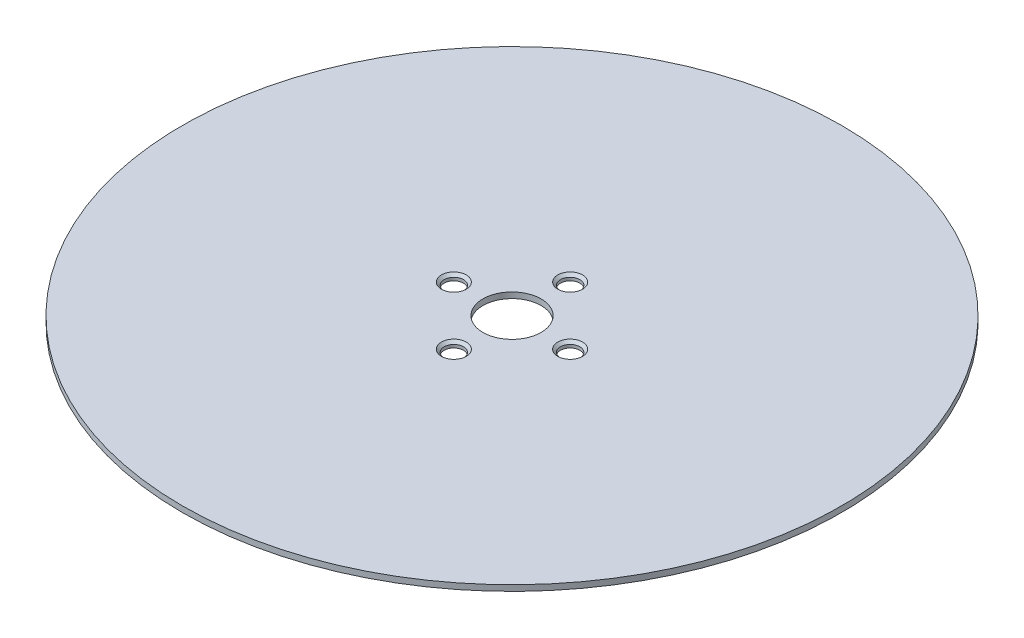
ISO-10303-21;
HEADER;
FILE_DESCRIPTION(('STEP AP214'),'2;1');
FILE_NAME('part.step','',(''),(''),'','','');
FILE_SCHEMA(('AUTOMOTIVE_DESIGN { 1 0 10303 214 1 1 1 1 }'));
ENDSEC;
DATA;
#1=APPLICATION_CONTEXT('core data for automotive mechanical design processes');
#2=APPLICATION_PROTOCOL_DEFINITION('international standard','automotive_design',2000,#1);
#3=PRODUCT_CONTEXT('',#1,'mechanical');
#4=PRODUCT('Part','Part','',(#3));
#5=PRODUCT_RELATED_PRODUCT_CATEGORY('part','',(#4));
#6=PRODUCT_DEFINITION_FORMATION('','',#4);
#7=PRODUCT_DEFINITION_CONTEXT('part definition',#1,'design');
#8=PRODUCT_DEFINITION('design','',#6,#7);
#9=PRODUCT_DEFINITION_SHAPE('','',#8);
#10=(LENGTH_UNIT() NAMED_UNIT(*) SI_UNIT(.MILLI.,.METRE.));
#11=(NAMED_UNIT(*) PLANE_ANGLE_UNIT() SI_UNIT($,.RADIAN.));
#12=(NAMED_UNIT(*) SI_UNIT($,.STERADIAN.) SOLID_ANGLE_UNIT());
#13=UNCERTAINTY_MEASURE_WITH_UNIT(LENGTH_MEASURE(1.E-05),#10,'distance_accuracy_value','');
#14=(GEOMETRIC_REPRESENTATION_CONTEXT(3) GLOBAL_UNCERTAINTY_ASSIGNED_CONTEXT((#13)) GLOBAL_UNIT_ASSIGNED_CONTEXT((#10,
#11,#12)) REPRESENTATION_CONTEXT('',''));
#15=CARTESIAN_POINT('',(0.,0.,0.));
#16=DIRECTION('',(0.,0.,1.));
#17=DIRECTION('',(1.,0.,0.));
#18=AXIS2_PLACEMENT_3D('',#15,#16,#17);
#19=CARTESIAN_POINT('',(0.,1.5,0.));
#20=DIRECTION('',(0.,-1.,0.));
#21=DIRECTION('',(0.,0.,-1.));
#22=AXIS2_PLACEMENT_3D('',#19,#20,#21);
#23=CYLINDRICAL_SURFACE('',#22,15.);
#24=CARTESIAN_POINT('',(0.,1.5,0.));
#25=DIRECTION('',(0.,1.,0.));
#26=DIRECTION('',(0.,0.,1.));
#27=AXIS2_PLACEMENT_3D('',#24,#25,#26);
#28=CIRCLE('',#27,15.);
#29=CARTESIAN_POINT('',(0.,1.5,15.));
#30=VERTEX_POINT('',#29);
#31=EDGE_CURVE('E42',#30,#30,#28,.T.);
#32=ORIENTED_EDGE('',*,*,#31,.T.);
#33=EDGE_LOOP('',(#32));
#34=FACE_BOUND('',#33,.T.);
#35=CARTESIAN_POINT('',(0.,-1.5,0.));
#36=DIRECTION('',(0.,1.,0.));
#37=DIRECTION('',(0.,0.,1.));
#38=AXIS2_PLACEMENT_3D('',#35,#36,#37);
#39=CIRCLE('',#38,15.);
#40=CARTESIAN_POINT('',(0.,-1.5,15.));
#41=VERTEX_POINT('',#40);
#42=EDGE_CURVE('E62',#41,#41,#39,.T.);
#43=ORIENTED_EDGE('',*,*,#42,.F.);
#44=EDGE_LOOP('',(#43));
#45=FACE_BOUND('',#44,.T.);
#46=ADVANCED_FACE('F34',(#34,#45),#23,.F.);
#47=CARTESIAN_POINT('',(1.01070499767852E-13,1.5,-30.));
#48=DIRECTION('',(0.,-1.,0.));
#49=DIRECTION('',(0.,0.,-1.));
#50=AXIS2_PLACEMENT_3D('',#47,#48,#49);
#51=CYLINDRICAL_SURFACE('',#50,5.);
#52=CARTESIAN_POINT('',(1.01070499767852E-13,0.100000000000001,-30.));
#53=DIRECTION('',(0.,1.,0.));
#54=DIRECTION('',(0.,0.,1.));
#55=AXIS2_PLACEMENT_3D('',#52,#53,#54);
#56=CIRCLE('',#55,5.);
#57=CARTESIAN_POINT('',(1.01070499767852E-13,0.100000000000001,-25.));
#58=VERTEX_POINT('',#57);
#59=EDGE_CURVE('E129',#58,#58,#56,.F.);
#60=ORIENTED_EDGE('',*,*,#59,.F.);
#61=EDGE_LOOP('',(#60));
#62=FACE_BOUND('',#61,.T.);
#63=CARTESIAN_POINT('',(1.01070499767852E-13,-1.5,-30.));
#64=DIRECTION('',(0.,1.,0.));
#65=DIRECTION('',(0.,0.,1.));
#66=AXIS2_PLACEMENT_3D('',#63,#64,#65);
#67=CIRCLE('',#66,5.);
#68=CARTESIAN_POINT('',(1.01070499767852E-13,-1.5,-25.));
#69=VERTEX_POINT('',#68);
#70=EDGE_CURVE('E60',#69,#69,#67,.T.);
#71=ORIENTED_EDGE('',*,*,#70,.F.);
#72=EDGE_LOOP('',(#71));
#73=FACE_BOUND('',#72,.T.);
#74=ADVANCED_FACE('F89',(#62,#73),#51,.F.);
#75=CARTESIAN_POINT('',(30.,1.5,2.05814939933146E-13));
#76=DIRECTION('',(0.,-1.,0.));
#77=DIRECTION('',(0.,0.,-1.));
#78=AXIS2_PLACEMENT_3D('',#75,#76,#77);
#79=CYLINDRICAL_SURFACE('',#78,5.);
#80=CARTESIAN_POINT('',(30.,0.0999999999999996,2.05814939933146E-13));
#81=DIRECTION('',(0.,1.,0.));
#82=DIRECTION('',(0.,0.,1.));
#83=AXIS2_PLACEMENT_3D('',#80,#81,#82);
#84=CIRCLE('',#83,5.);
#85=CARTESIAN_POINT('',(30.,0.0999999999999996,5.00000000000021));
#86=VERTEX_POINT('',#85);
#87=EDGE_CURVE('E121',#86,#86,#84,.F.);
#88=ORIENTED_EDGE('',*,*,#87,.F.);
#89=EDGE_LOOP('',(#88));
#90=FACE_BOUND('',#89,.T.);
#91=CARTESIAN_POINT('',(30.,-1.5,2.05814939933146E-13));
#92=DIRECTION('',(0.,1.,0.));
#93=DIRECTION('',(0.,0.,1.));
#94=AXIS2_PLACEMENT_3D('',#91,#92,#93);
#95=CIRCLE('',#94,5.);
#96=CARTESIAN_POINT('',(30.,-1.5,5.00000000000021));
#97=VERTEX_POINT('',#96);
#98=EDGE_CURVE('E57',#97,#97,#95,.T.);
#99=ORIENTED_EDGE('',*,*,#98,.F.);
#100=EDGE_LOOP('',(#99));
#101=FACE_BOUND('',#100,.T.);
#102=ADVANCED_FACE('F95',(#90,#101),#79,.F.);
#103=CARTESIAN_POINT('',(-3.1055938009844E-13,1.5,30.));
#104=DIRECTION('',(0.,-1.,0.));
#105=DIRECTION('',(0.,0.,-1.));
#106=AXIS2_PLACEMENT_3D('',#103,#104,#105);
#107=CYLINDRICAL_SURFACE('',#106,5.);
#108=CARTESIAN_POINT('',(-3.1055938009844E-13,0.100000000000001,30.));
#109=DIRECTION('',(0.,1.,0.));
#110=DIRECTION('',(0.,0.,1.));
#111=AXIS2_PLACEMENT_3D('',#108,#109,#110);
#112=CIRCLE('',#111,5.);
#113=CARTESIAN_POINT('',(-3.1055938009844E-13,0.100000000000001,35.));
#114=VERTEX_POINT('',#113);
#115=EDGE_CURVE('E54',#114,#114,#112,.F.);
#116=ORIENTED_EDGE('',*,*,#115,.F.);
#117=EDGE_LOOP('',(#116));
#118=FACE_BOUND('',#117,.T.);
#119=CARTESIAN_POINT('',(-3.1055938009844E-13,-1.5,30.));
#120=DIRECTION('',(0.,1.,0.));
#121=DIRECTION('',(0.,0.,1.));
#122=AXIS2_PLACEMENT_3D('',#119,#120,#121);
#123=CIRCLE('',#122,5.);
#124=CARTESIAN_POINT('',(-3.1055938009844E-13,-1.5,35.));
#125=VERTEX_POINT('',#124);
#126=EDGE_CURVE('E53',#125,#125,#123,.T.);
#127=ORIENTED_EDGE('',*,*,#126,.F.);
#128=EDGE_LOOP('',(#127));
#129=FACE_BOUND('',#128,.T.);
#130=ADVANCED_FACE('F101',(#118,#129),#107,.F.);
#131=CARTESIAN_POINT('',(-30.,1.5,0.));
#132=DIRECTION('',(0.,-1.,0.));
#133=DIRECTION('',(0.,0.,-1.));
#134=AXIS2_PLACEMENT_3D('',#131,#132,#133);
#135=CYLINDRICAL_SURFACE('',#134,5.);
#136=CARTESIAN_POINT('',(-30.,0.100000000000002,0.));
#137=DIRECTION('',(0.,1.,0.));
#138=DIRECTION('',(0.,0.,1.));
#139=AXIS2_PLACEMENT_3D('',#136,#137,#138);
#140=CIRCLE('',#139,5.);
#141=CARTESIAN_POINT('',(-30.,0.100000000000002,5.));
#142=VERTEX_POINT('',#141);
#143=EDGE_CURVE('E135',#142,#142,#140,.F.);
#144=ORIENTED_EDGE('',*,*,#143,.F.);
#145=EDGE_LOOP('',(#144));
#146=FACE_BOUND('',#145,.T.);
#147=CARTESIAN_POINT('',(-30.,-1.5,0.));
#148=DIRECTION('',(0.,1.,0.));
#149=DIRECTION('',(0.,0.,1.));
#150=AXIS2_PLACEMENT_3D('',#147,#148,#149);
#151=CIRCLE('',#150,5.);
#152=CARTESIAN_POINT('',(-30.,-1.5,5.));
#153=VERTEX_POINT('',#152);
#154=EDGE_CURVE('E50',#153,#153,#151,.T.);
#155=ORIENTED_EDGE('',*,*,#154,.F.);
#156=EDGE_LOOP('',(#155));
#157=FACE_BOUND('',#156,.T.);
#158=ADVANCED_FACE('F36',(#146,#157),#135,.F.);
#159=CARTESIAN_POINT('',(0.,1.5,0.));
#160=DIRECTION('',(0.,-1.,0.));
#161=DIRECTION('',(0.,0.,-1.));
#162=AXIS2_PLACEMENT_3D('',#159,#160,#161);
#163=CYLINDRICAL_SURFACE('',#162,170.);
#164=CARTESIAN_POINT('',(0.,1.5,0.));
#165=DIRECTION('',(0.,1.,0.));
#166=DIRECTION('',(0.,0.,1.));
#167=AXIS2_PLACEMENT_3D('',#164,#165,#166);
#168=CIRCLE('',#167,170.);
#169=CARTESIAN_POINT('',(0.,1.5,170.));
#170=VERTEX_POINT('',#169);
#171=EDGE_CURVE('E10',#170,#170,#168,.T.);
#172=ORIENTED_EDGE('',*,*,#171,.F.);
#173=EDGE_LOOP('',(#172));
#174=FACE_BOUND('',#173,.T.);
#175=CARTESIAN_POINT('',(0.,-1.5,0.));
#176=DIRECTION('',(0.,1.,0.));
#177=DIRECTION('',(0.,0.,1.));
#178=AXIS2_PLACEMENT_3D('',#175,#176,#177);
#179=CIRCLE('',#178,170.);
#180=CARTESIAN_POINT('',(0.,-1.5,170.));
#181=VERTEX_POINT('',#180);
#182=EDGE_CURVE('E38',#181,#181,#179,.T.);
#183=ORIENTED_EDGE('',*,*,#182,.T.);
#184=EDGE_LOOP('',(#183));
#185=FACE_BOUND('',#184,.T.);
#186=ADVANCED_FACE('F69',(#174,#185),#163,.T.);
#187=CARTESIAN_POINT('',(0.,1.5,0.));
#188=DIRECTION('',(0.,1.,0.));
#189=DIRECTION('',(0.,0.,1.));
#190=AXIS2_PLACEMENT_3D('',#187,#188,#189);
#191=PLANE('',#190);
#192=CARTESIAN_POINT('',(-30.,1.5,0.));
#193=DIRECTION('',(0.,1.,0.));
#194=DIRECTION('',(0.,0.,1.));
#195=AXIS2_PLACEMENT_3D('',#192,#193,#194);
#196=CIRCLE('',#195,6.4);
#197=CARTESIAN_POINT('',(-30.,1.5,6.4));
#198=VERTEX_POINT('',#197);
#199=EDGE_CURVE('E138',#198,#198,#196,.T.);
#200=ORIENTED_EDGE('',*,*,#199,.F.);
#201=EDGE_LOOP('',(#200));
#202=FACE_BOUND('',#201,.T.);
#203=CARTESIAN_POINT('',(1.01070499767852E-13,1.5,-30.));
#204=DIRECTION('',(0.,1.,0.));
#205=DIRECTION('',(0.,0.,1.));
#206=AXIS2_PLACEMENT_3D('',#203,#204,#205);
#207=CIRCLE('',#206,6.4);
#208=CARTESIAN_POINT('',(1.01070499767852E-13,1.5,-23.6));
#209=VERTEX_POINT('',#208);
#210=EDGE_CURVE('E132',#209,#209,#207,.T.);
#211=ORIENTED_EDGE('',*,*,#210,.F.);
#212=EDGE_LOOP('',(#211));
#213=FACE_BOUND('',#212,.T.);
#214=CARTESIAN_POINT('',(30.,1.5,2.05814939933146E-13));
#215=DIRECTION('',(0.,1.,0.));
#216=DIRECTION('',(0.,0.,1.));
#217=AXIS2_PLACEMENT_3D('',#214,#215,#216);
#218=CIRCLE('',#217,6.4);
#219=CARTESIAN_POINT('',(30.,1.5,6.40000000000021));
#220=VERTEX_POINT('',#219);
#221=EDGE_CURVE('E126',#220,#220,#218,.T.);
#222=ORIENTED_EDGE('',*,*,#221,.F.);
#223=EDGE_LOOP('',(#222));
#224=FACE_BOUND('',#223,.T.);
#225=CARTESIAN_POINT('',(-3.1055938009844E-13,1.5,30.));
#226=DIRECTION('',(0.,1.,0.));
#227=DIRECTION('',(0.,0.,1.));
#228=AXIS2_PLACEMENT_3D('',#225,#226,#227);
#229=CIRCLE('',#228,6.4);
#230=CARTESIAN_POINT('',(-3.1055938009844E-13,1.5,36.4));
#231=VERTEX_POINT('',#230);
#232=EDGE_CURVE('E119',#231,#231,#229,.T.);
#233=ORIENTED_EDGE('',*,*,#232,.F.);
#234=EDGE_LOOP('',(#233));
#235=FACE_BOUND('',#234,.T.);
#236=ORIENTED_EDGE('',*,*,#31,.F.);
#237=EDGE_LOOP('',(#236));
#238=FACE_BOUND('',#237,.T.);
#239=ORIENTED_EDGE('',*,*,#171,.T.);
#240=EDGE_LOOP('',(#239));
#241=FACE_BOUND('',#240,.T.);
#242=ADVANCED_FACE('F74',(#202,#213,#224,#235,#238,#241),#191,.T.);
#243=CARTESIAN_POINT('',(0.,-1.5,0.));
#244=DIRECTION('',(0.,1.,0.));
#245=DIRECTION('',(0.,0.,1.));
#246=AXIS2_PLACEMENT_3D('',#243,#244,#245);
#247=PLANE('',#246);
#248=ORIENTED_EDGE('',*,*,#154,.T.);
#249=EDGE_LOOP('',(#248));
#250=FACE_BOUND('',#249,.T.);
#251=ORIENTED_EDGE('',*,*,#126,.T.);
#252=EDGE_LOOP('',(#251));
#253=FACE_BOUND('',#252,.T.);
#254=ORIENTED_EDGE('',*,*,#98,.T.);
#255=EDGE_LOOP('',(#254));
#256=FACE_BOUND('',#255,.T.);
#257=ORIENTED_EDGE('',*,*,#70,.T.);
#258=EDGE_LOOP('',(#257));
#259=FACE_BOUND('',#258,.T.);
#260=ORIENTED_EDGE('',*,*,#42,.T.);
#261=EDGE_LOOP('',(#260));
#262=FACE_BOUND('',#261,.T.);
#263=ORIENTED_EDGE('',*,*,#182,.F.);
#264=EDGE_LOOP('',(#263));
#265=FACE_BOUND('',#264,.T.);
#266=ADVANCED_FACE('F71',(#250,#253,#256,#259,#262,#265),#247,.F.);
#267=CARTESIAN_POINT('',(-3.1055938009844E-13,1.5,30.));
#268=DIRECTION('',(0.,1.,0.));
#269=DIRECTION('',(0.,0.,1.));
#270=AXIS2_PLACEMENT_3D('',#267,#268,#269);
#271=CONICAL_SURFACE('',#270,6.4,0.785398163397448);
#272=ORIENTED_EDGE('',*,*,#115,.T.);
#273=EDGE_LOOP('',(#272));
#274=FACE_BOUND('',#273,.T.);
#275=ORIENTED_EDGE('',*,*,#232,.T.);
#276=EDGE_LOOP('',(#275));
#277=FACE_BOUND('',#276,.T.);
#278=ADVANCED_FACE('F73',(#274,#277),#271,.F.);
#279=CARTESIAN_POINT('',(30.,1.5,2.05814939933146E-13));
#280=DIRECTION('',(0.,1.,0.));
#281=DIRECTION('',(0.,0.,1.));
#282=AXIS2_PLACEMENT_3D('',#279,#280,#281);
#283=CONICAL_SURFACE('',#282,6.4,0.785398163397449);
#284=ORIENTED_EDGE('',*,*,#87,.T.);
#285=EDGE_LOOP('',(#284));
#286=FACE_BOUND('',#285,.T.);
#287=ORIENTED_EDGE('',*,*,#221,.T.);
#288=EDGE_LOOP('',(#287));
#289=FACE_BOUND('',#288,.T.);
#290=ADVANCED_FACE('F81',(#286,#289),#283,.F.);
#291=CARTESIAN_POINT('',(1.01070499767852E-13,1.5,-30.));
#292=DIRECTION('',(0.,1.,0.));
#293=DIRECTION('',(0.,0.,1.));
#294=AXIS2_PLACEMENT_3D('',#291,#292,#293);
#295=CONICAL_SURFACE('',#294,6.4,0.785398163397448);
#296=ORIENTED_EDGE('',*,*,#59,.T.);
#297=EDGE_LOOP('',(#296));
#298=FACE_BOUND('',#297,.T.);
#299=ORIENTED_EDGE('',*,*,#210,.T.);
#300=EDGE_LOOP('',(#299));
#301=FACE_BOUND('',#300,.T.);
#302=ADVANCED_FACE('F154',(#298,#301),#295,.F.);
#303=CARTESIAN_POINT('',(-30.,1.5,0.));
#304=DIRECTION('',(0.,1.,0.));
#305=DIRECTION('',(0.,0.,1.));
#306=AXIS2_PLACEMENT_3D('',#303,#304,#305);
#307=CONICAL_SURFACE('',#306,6.4,0.785398163397448);
#308=ORIENTED_EDGE('',*,*,#143,.T.);
#309=EDGE_LOOP('',(#308));
#310=FACE_BOUND('',#309,.T.);
#311=ORIENTED_EDGE('',*,*,#199,.T.);
#312=EDGE_LOOP('',(#311));
#313=FACE_BOUND('',#312,.T.);
#314=ADVANCED_FACE('F142',(#310,#313),#307,.F.);
#315=CLOSED_SHELL('',(#46,#74,#102,#130,#158,#186,#242,#266,#278,#290,#302,#314));
#316=MANIFOLD_SOLID_BREP('B2',#315);
#317=ADVANCED_BREP_SHAPE_REPRESENTATION('',(#18,#316),#14);
#318=SHAPE_DEFINITION_REPRESENTATION(#9,#317);
ENDSEC;
END-ISO-10303-21;
